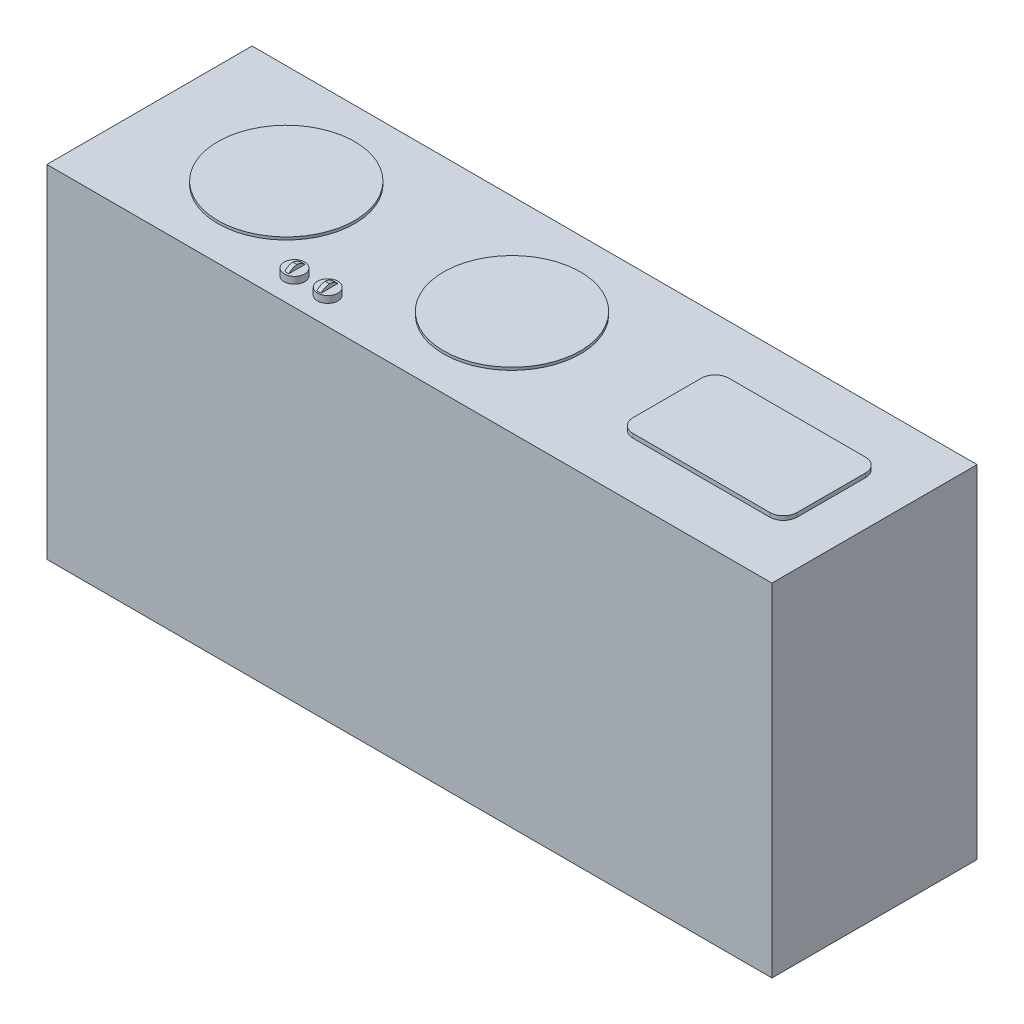
ISO-10303-21;
HEADER;
FILE_DESCRIPTION(('STEP AP214'),'2;1');
FILE_NAME('part.step','',(''),(''),'','','');
FILE_SCHEMA(('AUTOMOTIVE_DESIGN { 1 0 10303 214 1 1 1 1 }'));
ENDSEC;
DATA;
#1=APPLICATION_CONTEXT('core data for automotive mechanical design processes');
#2=APPLICATION_PROTOCOL_DEFINITION('international standard','automotive_design',2000,#1);
#3=PRODUCT_CONTEXT('',#1,'mechanical');
#4=PRODUCT('Part','Part','',(#3));
#5=PRODUCT_RELATED_PRODUCT_CATEGORY('part','',(#4));
#6=PRODUCT_DEFINITION_FORMATION('','',#4);
#7=PRODUCT_DEFINITION_CONTEXT('part definition',#1,'design');
#8=PRODUCT_DEFINITION('design','',#6,#7);
#9=PRODUCT_DEFINITION_SHAPE('','',#8);
#10=(LENGTH_UNIT() NAMED_UNIT(*) SI_UNIT(.MILLI.,.METRE.));
#11=(NAMED_UNIT(*) PLANE_ANGLE_UNIT() SI_UNIT($,.RADIAN.));
#12=(NAMED_UNIT(*) SI_UNIT($,.STERADIAN.) SOLID_ANGLE_UNIT());
#13=UNCERTAINTY_MEASURE_WITH_UNIT(LENGTH_MEASURE(1.E-05),#10,'distance_accuracy_value','');
#14=(GEOMETRIC_REPRESENTATION_CONTEXT(3) GLOBAL_UNCERTAINTY_ASSIGNED_CONTEXT((#13)) GLOBAL_UNIT_ASSIGNED_CONTEXT((#10,
#11,#12)) REPRESENTATION_CONTEXT('',''));
#15=CARTESIAN_POINT('',(0.,0.,0.));
#16=DIRECTION('',(0.,0.,1.));
#17=DIRECTION('',(1.,0.,0.));
#18=AXIS2_PLACEMENT_3D('',#15,#16,#17);
#19=CARTESIAN_POINT('',(0.,25.,0.));
#20=DIRECTION('',(0.,1.,0.));
#21=DIRECTION('',(0.,0.,1.));
#22=AXIS2_PLACEMENT_3D('',#19,#20,#21);
#23=PLANE('',#22);
#24=CARTESIAN_POINT('',(-10.3997029520215,25.,5.50084864158862));
#25=DIRECTION('',(0.,1.,0.));
#26=DIRECTION('',(0.,0.,1.));
#27=AXIS2_PLACEMENT_3D('',#24,#25,#26);
#28=CIRCLE('',#27,0.75);
#29=CARTESIAN_POINT('',(-10.3997029520215,25.,6.25084864158862));
#30=VERTEX_POINT('',#29);
#31=EDGE_CURVE('E222',#30,#30,#28,.T.);
#32=ORIENTED_EDGE('',*,*,#31,.F.);
#33=EDGE_LOOP('',(#32));
#34=FACE_BOUND('',#33,.T.);
#35=CARTESIAN_POINT('',(-7.96817965296981,25.,5.50084864158862));
#36=DIRECTION('',(0.,1.,0.));
#37=DIRECTION('',(0.,0.,1.));
#38=AXIS2_PLACEMENT_3D('',#35,#36,#37);
#39=CIRCLE('',#38,0.75);
#40=CARTESIAN_POINT('',(-7.96817965296981,25.,6.25084864158862));
#41=VERTEX_POINT('',#40);
#42=EDGE_CURVE('E203',#41,#41,#39,.T.);
#43=ORIENTED_EDGE('',*,*,#42,.F.);
#44=EDGE_LOOP('',(#43));
#45=FACE_BOUND('',#44,.T.);
#46=CARTESIAN_POINT('',(-16.5,25.,0.));
#47=DIRECTION('',(0.,1.,0.));
#48=DIRECTION('',(0.,0.,1.));
#49=AXIS2_PLACEMENT_3D('',#46,#47,#48);
#50=CIRCLE('',#49,5.);
#51=CARTESIAN_POINT('',(-16.5,25.,5.));
#52=VERTEX_POINT('',#51);
#53=EDGE_CURVE('E207',#52,#52,#50,.T.);
#54=ORIENTED_EDGE('',*,*,#53,.F.);
#55=EDGE_LOOP('',(#54));
#56=FACE_BOUND('',#55,.T.);
#57=CARTESIAN_POINT('',(0.,25.,0.));
#58=DIRECTION('',(0.,1.,0.));
#59=DIRECTION('',(0.,0.,1.));
#60=AXIS2_PLACEMENT_3D('',#57,#58,#59);
#61=CIRCLE('',#60,5.);
#62=CARTESIAN_POINT('',(0.,25.,5.));
#63=VERTEX_POINT('',#62);
#64=EDGE_CURVE('E219',#63,#63,#61,.T.);
#65=ORIENTED_EDGE('',*,*,#64,.F.);
#66=EDGE_LOOP('',(#65));
#67=FACE_BOUND('',#66,.T.);
#68=DIRECTION('',(0.,0.,-1.));
#69=VECTOR('',#68,1.);
#70=CARTESIAN_POINT('',(26.5,25.,-7.5));
#71=LINE('',#70,#69);
#72=CARTESIAN_POINT('',(26.5,25.,7.5));
#73=VERTEX_POINT('',#72);
#74=CARTESIAN_POINT('',(26.5,25.,-7.5));
#75=VERTEX_POINT('',#74);
#76=EDGE_CURVE('E224',#73,#75,#71,.T.);
#77=ORIENTED_EDGE('',*,*,#76,.T.);
#78=DIRECTION('',(-1.,0.,0.));
#79=VECTOR('',#78,1.);
#80=CARTESIAN_POINT('',(-26.5,25.,-7.5));
#81=LINE('',#80,#79);
#82=CARTESIAN_POINT('',(-26.5,25.,-7.5));
#83=VERTEX_POINT('',#82);
#84=EDGE_CURVE('E227',#75,#83,#81,.T.);
#85=ORIENTED_EDGE('',*,*,#84,.T.);
#86=DIRECTION('',(0.,0.,1.));
#87=VECTOR('',#86,1.);
#88=CARTESIAN_POINT('',(-26.5,25.,-7.5));
#89=LINE('',#88,#87);
#90=CARTESIAN_POINT('',(-26.5,25.,7.5));
#91=VERTEX_POINT('',#90);
#92=EDGE_CURVE('E230',#83,#91,#89,.T.);
#93=ORIENTED_EDGE('',*,*,#92,.T.);
#94=DIRECTION('',(1.,0.,0.));
#95=VECTOR('',#94,1.);
#96=CARTESIAN_POINT('',(-26.5,25.,7.5));
#97=LINE('',#96,#95);
#98=EDGE_CURVE('E232',#91,#73,#97,.T.);
#99=ORIENTED_EDGE('',*,*,#98,.T.);
#100=EDGE_LOOP('',(#77,#85,#93,#99));
#101=FACE_BOUND('',#100,.T.);
#102=DIRECTION('',(-1.,0.,0.));
#103=VECTOR('',#102,1.);
#104=CARTESIAN_POINT('',(11.2507281110651,25.,-3.59474483548655));
#105=LINE('',#104,#103);
#106=CARTESIAN_POINT('',(22.2507281110651,25.,-3.59474483548655));
#107=VERTEX_POINT('',#106);
#108=CARTESIAN_POINT('',(12.2507281110651,25.,-3.59474483548655));
#109=VERTEX_POINT('',#108);
#110=EDGE_CURVE('E301',#107,#109,#105,.T.);
#111=ORIENTED_EDGE('',*,*,#110,.F.);
#112=CARTESIAN_POINT('',(22.2507281110651,25.,-2.59474483548655));
#113=DIRECTION('',(0.,1.,0.));
#114=DIRECTION('',(0.,0.,1.));
#115=AXIS2_PLACEMENT_3D('',#112,#113,#114);
#116=CIRCLE('',#115,1.);
#117=CARTESIAN_POINT('',(23.2507281110651,25.,-2.59474483548655));
#118=VERTEX_POINT('',#117);
#119=EDGE_CURVE('E286',#107,#118,#116,.F.);
#120=ORIENTED_EDGE('',*,*,#119,.T.);
#121=DIRECTION('',(0.,0.,-1.));
#122=VECTOR('',#121,1.);
#123=CARTESIAN_POINT('',(23.2507281110651,25.,-3.59474483548655));
#124=LINE('',#123,#122);
#125=CARTESIAN_POINT('',(23.2507281110651,25.,2.40525516451345));
#126=VERTEX_POINT('',#125);
#127=EDGE_CURVE('E297',#126,#118,#124,.T.);
#128=ORIENTED_EDGE('',*,*,#127,.F.);
#129=CARTESIAN_POINT('',(22.2507281110651,25.,2.40525516451345));
#130=DIRECTION('',(0.,1.,0.));
#131=DIRECTION('',(0.,0.,1.));
#132=AXIS2_PLACEMENT_3D('',#129,#130,#131);
#133=CIRCLE('',#132,1.);
#134=CARTESIAN_POINT('',(22.2507281110651,25.,3.40525516451345));
#135=VERTEX_POINT('',#134);
#136=EDGE_CURVE('E288',#126,#135,#133,.F.);
#137=ORIENTED_EDGE('',*,*,#136,.T.);
#138=DIRECTION('',(1.,0.,0.));
#139=VECTOR('',#138,1.);
#140=CARTESIAN_POINT('',(11.2507281110651,25.,3.40525516451345));
#141=LINE('',#140,#139);
#142=CARTESIAN_POINT('',(12.2507281110651,25.,3.40525516451345));
#143=VERTEX_POINT('',#142);
#144=EDGE_CURVE('E594',#143,#135,#141,.T.);
#145=ORIENTED_EDGE('',*,*,#144,.F.);
#146=CARTESIAN_POINT('',(12.2507281110651,25.,2.40525516451345));
#147=DIRECTION('',(0.,1.,0.));
#148=DIRECTION('',(0.,0.,1.));
#149=AXIS2_PLACEMENT_3D('',#146,#147,#148);
#150=CIRCLE('',#149,1.);
#151=CARTESIAN_POINT('',(11.2507281110651,25.,2.40525516451345));
#152=VERTEX_POINT('',#151);
#153=EDGE_CURVE('E282',#143,#152,#150,.F.);
#154=ORIENTED_EDGE('',*,*,#153,.T.);
#155=DIRECTION('',(0.,0.,1.));
#156=VECTOR('',#155,1.);
#157=CARTESIAN_POINT('',(11.2507281110651,25.,-3.59474483548655));
#158=LINE('',#157,#156);
#159=CARTESIAN_POINT('',(11.2507281110651,25.,-2.59474483548655));
#160=VERTEX_POINT('',#159);
#161=EDGE_CURVE('E591',#160,#152,#158,.T.);
#162=ORIENTED_EDGE('',*,*,#161,.F.);
#163=CARTESIAN_POINT('',(12.2507281110651,25.,-2.59474483548655));
#164=DIRECTION('',(0.,1.,0.));
#165=DIRECTION('',(0.,0.,1.));
#166=AXIS2_PLACEMENT_3D('',#163,#164,#165);
#167=CIRCLE('',#166,1.);
#168=EDGE_CURVE('E284',#160,#109,#167,.F.);
#169=ORIENTED_EDGE('',*,*,#168,.T.);
#170=EDGE_LOOP('',(#111,#120,#128,#137,#145,#154,#162,#169));
#171=FACE_BOUND('',#170,.T.);
#172=ADVANCED_FACE('F33',(#34,#45,#56,#67,#101,#171),#23,.T.);
#173=CARTESIAN_POINT('',(26.5,25.,-7.5));
#174=DIRECTION('',(-1.,0.,0.));
#175=DIRECTION('',(0.,0.,1.));
#176=AXIS2_PLACEMENT_3D('',#173,#174,#175);
#177=PLANE('',#176);
#178=DIRECTION('',(0.,0.,-1.));
#179=VECTOR('',#178,1.);
#180=CARTESIAN_POINT('',(26.5,0.,-7.5));
#181=LINE('',#180,#179);
#182=CARTESIAN_POINT('',(26.5,0.,7.5));
#183=VERTEX_POINT('',#182);
#184=CARTESIAN_POINT('',(26.5,0.,-7.5));
#185=VERTEX_POINT('',#184);
#186=EDGE_CURVE('E218',#183,#185,#181,.T.);
#187=ORIENTED_EDGE('',*,*,#186,.T.);
#188=DIRECTION('',(0.,-1.,0.));
#189=VECTOR('',#188,1.);
#190=CARTESIAN_POINT('',(26.5,25.,-7.5));
#191=LINE('',#190,#189);
#192=EDGE_CURVE('E223',#75,#185,#191,.T.);
#193=ORIENTED_EDGE('',*,*,#192,.F.);
#194=ORIENTED_EDGE('',*,*,#76,.F.);
#195=DIRECTION('',(0.,-1.,0.));
#196=VECTOR('',#195,1.);
#197=CARTESIAN_POINT('',(26.5,25.,7.5));
#198=LINE('',#197,#196);
#199=EDGE_CURVE('E234',#73,#183,#198,.T.);
#200=ORIENTED_EDGE('',*,*,#199,.T.);
#201=EDGE_LOOP('',(#187,#193,#194,#200));
#202=FACE_BOUND('',#201,.T.);
#203=ADVANCED_FACE('F327',(#202),#177,.F.);
#204=CARTESIAN_POINT('',(-26.5,25.,-7.5));
#205=DIRECTION('',(0.,0.,1.));
#206=DIRECTION('',(1.,0.,0.));
#207=AXIS2_PLACEMENT_3D('',#204,#205,#206);
#208=PLANE('',#207);
#209=DIRECTION('',(-1.,0.,0.));
#210=VECTOR('',#209,1.);
#211=CARTESIAN_POINT('',(-26.5,0.,-7.5));
#212=LINE('',#211,#210);
#213=CARTESIAN_POINT('',(-26.5,0.,-7.5));
#214=VERTEX_POINT('',#213);
#215=EDGE_CURVE('E237',#185,#214,#212,.T.);
#216=ORIENTED_EDGE('',*,*,#215,.T.);
#217=DIRECTION('',(0.,-1.,0.));
#218=VECTOR('',#217,1.);
#219=CARTESIAN_POINT('',(-26.5,25.,-7.5));
#220=LINE('',#219,#218);
#221=EDGE_CURVE('E247',#83,#214,#220,.T.);
#222=ORIENTED_EDGE('',*,*,#221,.F.);
#223=ORIENTED_EDGE('',*,*,#84,.F.);
#224=ORIENTED_EDGE('',*,*,#192,.T.);
#225=EDGE_LOOP('',(#216,#222,#223,#224));
#226=FACE_BOUND('',#225,.T.);
#227=ADVANCED_FACE('F335',(#226),#208,.F.);
#228=CARTESIAN_POINT('',(-26.5,25.,-7.5));
#229=DIRECTION('',(1.,0.,0.));
#230=DIRECTION('',(0.,0.,-1.));
#231=AXIS2_PLACEMENT_3D('',#228,#229,#230);
#232=PLANE('',#231);
#233=DIRECTION('',(0.,0.,1.));
#234=VECTOR('',#233,1.);
#235=CARTESIAN_POINT('',(-26.5,0.,-7.5));
#236=LINE('',#235,#234);
#237=CARTESIAN_POINT('',(-26.5,0.,7.5));
#238=VERTEX_POINT('',#237);
#239=EDGE_CURVE('E239',#214,#238,#236,.T.);
#240=ORIENTED_EDGE('',*,*,#239,.T.);
#241=DIRECTION('',(0.,-1.,0.));
#242=VECTOR('',#241,1.);
#243=CARTESIAN_POINT('',(-26.5,25.,7.5));
#244=LINE('',#243,#242);
#245=EDGE_CURVE('E244',#91,#238,#244,.T.);
#246=ORIENTED_EDGE('',*,*,#245,.F.);
#247=ORIENTED_EDGE('',*,*,#92,.F.);
#248=ORIENTED_EDGE('',*,*,#221,.T.);
#249=EDGE_LOOP('',(#240,#246,#247,#248));
#250=FACE_BOUND('',#249,.T.);
#251=ADVANCED_FACE('F351',(#250),#232,.F.);
#252=CARTESIAN_POINT('',(-26.5,25.,7.5));
#253=DIRECTION('',(0.,0.,-1.));
#254=DIRECTION('',(-1.,0.,0.));
#255=AXIS2_PLACEMENT_3D('',#252,#253,#254);
#256=PLANE('',#255);
#257=DIRECTION('',(1.,0.,0.));
#258=VECTOR('',#257,1.);
#259=CARTESIAN_POINT('',(-26.5,0.,7.5));
#260=LINE('',#259,#258);
#261=EDGE_CURVE('E228',#238,#183,#260,.T.);
#262=ORIENTED_EDGE('',*,*,#261,.T.);
#263=ORIENTED_EDGE('',*,*,#199,.F.);
#264=ORIENTED_EDGE('',*,*,#98,.F.);
#265=ORIENTED_EDGE('',*,*,#245,.T.);
#266=EDGE_LOOP('',(#262,#263,#264,#265));
#267=FACE_BOUND('',#266,.T.);
#268=ADVANCED_FACE('F347',(#267),#256,.F.);
#269=CARTESIAN_POINT('',(0.,0.,0.));
#270=DIRECTION('',(0.,1.,0.));
#271=DIRECTION('',(0.,0.,1.));
#272=AXIS2_PLACEMENT_3D('',#269,#270,#271);
#273=PLANE('',#272);
#274=ORIENTED_EDGE('',*,*,#186,.F.);
#275=ORIENTED_EDGE('',*,*,#261,.F.);
#276=ORIENTED_EDGE('',*,*,#239,.F.);
#277=ORIENTED_EDGE('',*,*,#215,.F.);
#278=EDGE_LOOP('',(#274,#275,#276,#277));
#279=FACE_BOUND('',#278,.T.);
#280=ADVANCED_FACE('F344',(#279),#273,.F.);
#281=CARTESIAN_POINT('',(0.,25.2,0.));
#282=DIRECTION('',(0.,-1.,0.));
#283=DIRECTION('',(0.,0.,-1.));
#284=AXIS2_PLACEMENT_3D('',#281,#282,#283);
#285=CYLINDRICAL_SURFACE('',#284,5.);
#286=CARTESIAN_POINT('',(0.,25.2,0.));
#287=DIRECTION('',(0.,1.,0.));
#288=DIRECTION('',(0.,0.,1.));
#289=AXIS2_PLACEMENT_3D('',#286,#287,#288);
#290=CIRCLE('',#289,5.);
#291=CARTESIAN_POINT('',(0.,25.2,5.));
#292=VERTEX_POINT('',#291);
#293=EDGE_CURVE('E213',#292,#292,#290,.T.);
#294=ORIENTED_EDGE('',*,*,#293,.F.);
#295=EDGE_LOOP('',(#294));
#296=FACE_BOUND('',#295,.T.);
#297=ORIENTED_EDGE('',*,*,#64,.T.);
#298=EDGE_LOOP('',(#297));
#299=FACE_BOUND('',#298,.T.);
#300=ADVANCED_FACE('F342',(#296,#299),#285,.T.);
#301=CARTESIAN_POINT('',(0.,25.2,0.));
#302=DIRECTION('',(0.,1.,0.));
#303=DIRECTION('',(0.,0.,1.));
#304=AXIS2_PLACEMENT_3D('',#301,#302,#303);
#305=PLANE('',#304);
#306=ORIENTED_EDGE('',*,*,#293,.T.);
#307=EDGE_LOOP('',(#306));
#308=FACE_BOUND('',#307,.T.);
#309=ADVANCED_FACE('F522',(#308),#305,.T.);
#310=CARTESIAN_POINT('',(-16.5,25.2,0.));
#311=DIRECTION('',(0.,-1.,0.));
#312=DIRECTION('',(0.,0.,-1.));
#313=AXIS2_PLACEMENT_3D('',#310,#311,#312);
#314=CYLINDRICAL_SURFACE('',#313,5.);
#315=CARTESIAN_POINT('',(-16.5,25.2,0.));
#316=DIRECTION('',(0.,1.,0.));
#317=DIRECTION('',(0.,0.,1.));
#318=AXIS2_PLACEMENT_3D('',#315,#316,#317);
#319=CIRCLE('',#318,5.);
#320=CARTESIAN_POINT('',(-16.5,25.2,5.));
#321=VERTEX_POINT('',#320);
#322=EDGE_CURVE('E210',#321,#321,#319,.T.);
#323=ORIENTED_EDGE('',*,*,#322,.F.);
#324=EDGE_LOOP('',(#323));
#325=FACE_BOUND('',#324,.T.);
#326=ORIENTED_EDGE('',*,*,#53,.T.);
#327=EDGE_LOOP('',(#326));
#328=FACE_BOUND('',#327,.T.);
#329=ADVANCED_FACE('F514',(#325,#328),#314,.T.);
#330=CARTESIAN_POINT('',(-16.5,25.2,0.));
#331=DIRECTION('',(0.,1.,0.));
#332=DIRECTION('',(0.,0.,1.));
#333=AXIS2_PLACEMENT_3D('',#330,#331,#332);
#334=PLANE('',#333);
#335=ORIENTED_EDGE('',*,*,#322,.T.);
#336=EDGE_LOOP('',(#335));
#337=FACE_BOUND('',#336,.T.);
#338=ADVANCED_FACE('F507',(#337),#334,.T.);
#339=CARTESIAN_POINT('',(-7.96817965296981,25.5,5.50084864158862));
#340=DIRECTION('',(0.,-1.,0.));
#341=DIRECTION('',(0.,0.,-1.));
#342=AXIS2_PLACEMENT_3D('',#339,#340,#341);
#343=CYLINDRICAL_SURFACE('',#342,0.75);
#344=CARTESIAN_POINT('',(-7.96817965296981,25.5,5.50084864158862));
#345=DIRECTION('',(0.,1.,0.));
#346=DIRECTION('',(0.,0.,1.));
#347=AXIS2_PLACEMENT_3D('',#344,#345,#346);
#348=CIRCLE('',#347,0.75);
#349=CARTESIAN_POINT('',(-7.96817965296981,25.5,6.25084864158862));
#350=VERTEX_POINT('',#349);
#351=EDGE_CURVE('E204',#350,#350,#348,.T.);
#352=ORIENTED_EDGE('',*,*,#351,.F.);
#353=EDGE_LOOP('',(#352));
#354=FACE_BOUND('',#353,.T.);
#355=ORIENTED_EDGE('',*,*,#42,.T.);
#356=EDGE_LOOP('',(#355));
#357=FACE_BOUND('',#356,.T.);
#358=ADVANCED_FACE('F499',(#354,#357),#343,.T.);
#359=CARTESIAN_POINT('',(0.,25.5,0.));
#360=DIRECTION('',(0.,1.,0.));
#361=DIRECTION('',(0.,0.,1.));
#362=AXIS2_PLACEMENT_3D('',#359,#360,#361);
#363=PLANE('',#362);
#364=DIRECTION('',(0.,0.,1.));
#365=VECTOR('',#364,1.);
#366=CARTESIAN_POINT('',(-8.14054883727522,25.5,6.12687016507607));
#367=LINE('',#366,#365);
#368=CARTESIAN_POINT('',(-8.14054883727522,25.5,4.89916956078673));
#369=VERTEX_POINT('',#368);
#370=CARTESIAN_POINT('',(-8.14054883727522,25.5,6.12687016507607));
#371=VERTEX_POINT('',#370);
#372=EDGE_CURVE('E190',#369,#371,#367,.T.);
#373=ORIENTED_EDGE('',*,*,#372,.F.);
#374=DIRECTION('',(-1.,0.,0.));
#375=VECTOR('',#374,1.);
#376=CARTESIAN_POINT('',(-8.14054883727522,25.5,4.89916956078673));
#377=LINE('',#376,#375);
#378=CARTESIAN_POINT('',(-7.83253803311368,25.5,4.89916956078673));
#379=VERTEX_POINT('',#378);
#380=EDGE_CURVE('E197',#379,#369,#377,.T.);
#381=ORIENTED_EDGE('',*,*,#380,.F.);
#382=DIRECTION('',(0.,0.,-1.));
#383=VECTOR('',#382,1.);
#384=CARTESIAN_POINT('',(-7.83253803311368,25.5,6.12687016507607));
#385=LINE('',#384,#383);
#386=CARTESIAN_POINT('',(-7.83253803311368,25.5,6.12687016507607));
#387=VERTEX_POINT('',#386);
#388=EDGE_CURVE('E195',#387,#379,#385,.T.);
#389=ORIENTED_EDGE('',*,*,#388,.F.);
#390=DIRECTION('',(1.,0.,0.));
#391=VECTOR('',#390,1.);
#392=CARTESIAN_POINT('',(-8.14054883727522,25.5,6.12687016507607));
#393=LINE('',#392,#391);
#394=EDGE_CURVE('E192',#371,#387,#393,.T.);
#395=ORIENTED_EDGE('',*,*,#394,.F.);
#396=EDGE_LOOP('',(#373,#381,#389,#395));
#397=FACE_BOUND('',#396,.T.);
#398=ORIENTED_EDGE('',*,*,#351,.T.);
#399=EDGE_LOOP('',(#398));
#400=FACE_BOUND('',#399,.T.);
#401=ADVANCED_FACE('F312',(#397,#400),#363,.T.);
#402=CARTESIAN_POINT('',(-10.3997029520215,25.5,5.50084864158862));
#403=DIRECTION('',(0.,-1.,0.));
#404=DIRECTION('',(0.,0.,-1.));
#405=AXIS2_PLACEMENT_3D('',#402,#403,#404);
#406=CYLINDRICAL_SURFACE('',#405,0.75);
#407=CARTESIAN_POINT('',(-10.3997029520215,25.5,5.50084864158862));
#408=DIRECTION('',(0.,1.,0.));
#409=DIRECTION('',(0.,0.,1.));
#410=AXIS2_PLACEMENT_3D('',#407,#408,#409);
#411=CIRCLE('',#410,0.75);
#412=CARTESIAN_POINT('',(-10.3997029520215,25.5,6.25084864158862));
#413=VERTEX_POINT('',#412);
#414=EDGE_CURVE('E200',#413,#413,#411,.F.);
#415=ORIENTED_EDGE('',*,*,#414,.T.);
#416=EDGE_LOOP('',(#415));
#417=FACE_BOUND('',#416,.T.);
#418=ORIENTED_EDGE('',*,*,#31,.T.);
#419=EDGE_LOOP('',(#418));
#420=FACE_BOUND('',#419,.T.);
#421=ADVANCED_FACE('F484',(#417,#420),#406,.T.);
#422=CARTESIAN_POINT('',(0.,25.5,0.));
#423=DIRECTION('',(0.,1.,0.));
#424=DIRECTION('',(0.,0.,1.));
#425=AXIS2_PLACEMENT_3D('',#422,#423,#424);
#426=PLANE('',#425);
#427=DIRECTION('',(0.,0.,1.));
#428=VECTOR('',#427,1.);
#429=CARTESIAN_POINT('',(-10.5403281985983,25.5,6.07704960419309));
#430=LINE('',#429,#428);
#431=CARTESIAN_POINT('',(-10.5403281985983,25.5,4.88581295215074));
#432=VERTEX_POINT('',#431);
#433=CARTESIAN_POINT('',(-10.5403281985983,25.5,6.07704960419309));
#434=VERTEX_POINT('',#433);
#435=EDGE_CURVE('E183',#432,#434,#430,.T.);
#436=ORIENTED_EDGE('',*,*,#435,.F.);
#437=DIRECTION('',(-1.,0.,0.));
#438=VECTOR('',#437,1.);
#439=CARTESIAN_POINT('',(-10.5403281985983,25.5,4.88581295215074));
#440=LINE('',#439,#438);
#441=CARTESIAN_POINT('',(-10.2393980436624,25.5,4.88581295215074));
#442=VERTEX_POINT('',#441);
#443=EDGE_CURVE('E178',#442,#432,#440,.T.);
#444=ORIENTED_EDGE('',*,*,#443,.F.);
#445=DIRECTION('',(0.,0.,-1.));
#446=VECTOR('',#445,1.);
#447=CARTESIAN_POINT('',(-10.2393980436624,25.5,6.07704960419309));
#448=LINE('',#447,#446);
#449=CARTESIAN_POINT('',(-10.2393980436624,25.5,6.07704960419309));
#450=VERTEX_POINT('',#449);
#451=EDGE_CURVE('E162',#450,#442,#448,.T.);
#452=ORIENTED_EDGE('',*,*,#451,.F.);
#453=DIRECTION('',(1.,0.,0.));
#454=VECTOR('',#453,1.);
#455=CARTESIAN_POINT('',(-10.5403281985983,25.5,6.07704960419309));
#456=LINE('',#455,#454);
#457=EDGE_CURVE('E175',#434,#450,#456,.T.);
#458=ORIENTED_EDGE('',*,*,#457,.F.);
#459=EDGE_LOOP('',(#436,#444,#452,#458));
#460=FACE_BOUND('',#459,.T.);
#461=ORIENTED_EDGE('',*,*,#414,.F.);
#462=EDGE_LOOP('',(#461));
#463=FACE_BOUND('',#462,.T.);
#464=ADVANCED_FACE('F173',(#460,#463),#426,.T.);
#465=CARTESIAN_POINT('',(-8.14054883727522,25.8,6.12687016507607));
#466=DIRECTION('',(1.,0.,0.));
#467=DIRECTION('',(0.,0.,-1.));
#468=AXIS2_PLACEMENT_3D('',#465,#466,#467);
#469=PLANE('',#468);
#470=ORIENTED_EDGE('',*,*,#372,.T.);
#471=CARTESIAN_POINT('',(-8.14054883727522,24.8,5.41272732222178));
#472=DIRECTION('',(1.,0.,0.));
#473=DIRECTION('',(0.,0.,-1.));
#474=AXIS2_PLACEMENT_3D('',#471,#472,#473);
#475=CIRCLE('',#474,1.);
#476=CARTESIAN_POINT('',(-8.14054883727522,25.7949579922178,5.5130198629314));
#477=VERTEX_POINT('',#476);
#478=EDGE_CURVE('E11',#371,#477,#475,.F.);
#479=ORIENTED_EDGE('',*,*,#478,.T.);
#480=CARTESIAN_POINT('',(-8.14054883727522,24.8,5.61331240364102));
#481=DIRECTION('',(1.,0.,0.));
#482=DIRECTION('',(0.,0.,-1.));
#483=AXIS2_PLACEMENT_3D('',#480,#481,#482);
#484=CIRCLE('',#483,1.);
#485=EDGE_CURVE('E42',#477,#369,#484,.F.);
#486=ORIENTED_EDGE('',*,*,#485,.T.);
#487=EDGE_LOOP('',(#470,#479,#486));
#488=FACE_BOUND('',#487,.T.);
#489=ADVANCED_FACE('F310',(#488),#469,.F.);
#490=CARTESIAN_POINT('',(-7.83253803311368,25.8,6.12687016507607));
#491=DIRECTION('',(-1.,0.,0.));
#492=DIRECTION('',(0.,0.,1.));
#493=AXIS2_PLACEMENT_3D('',#490,#491,#492);
#494=PLANE('',#493);
#495=CARTESIAN_POINT('',(-7.83253803311368,24.8,5.61331240364102));
#496=DIRECTION('',(-1.,0.,0.));
#497=DIRECTION('',(0.,0.,1.));
#498=AXIS2_PLACEMENT_3D('',#495,#496,#497);
#499=CIRCLE('',#498,1.);
#500=CARTESIAN_POINT('',(-7.83253803311368,25.7949579922178,5.5130198629314));
#501=VERTEX_POINT('',#500);
#502=EDGE_CURVE('E56',#379,#501,#499,.F.);
#503=ORIENTED_EDGE('',*,*,#502,.T.);
#504=CARTESIAN_POINT('',(-7.83253803311368,24.8,5.41272732222178));
#505=DIRECTION('',(-1.,0.,0.));
#506=DIRECTION('',(0.,0.,1.));
#507=AXIS2_PLACEMENT_3D('',#504,#505,#506);
#508=CIRCLE('',#507,1.);
#509=EDGE_CURVE('E294',#501,#387,#508,.F.);
#510=ORIENTED_EDGE('',*,*,#509,.T.);
#511=ORIENTED_EDGE('',*,*,#388,.T.);
#512=EDGE_LOOP('',(#503,#510,#511));
#513=FACE_BOUND('',#512,.T.);
#514=ADVANCED_FACE('F315',(#513),#494,.F.);
#515=CARTESIAN_POINT('',(-10.5403281985983,25.8,6.07704960419309));
#516=DIRECTION('',(1.,0.,0.));
#517=DIRECTION('',(0.,0.,-1.));
#518=AXIS2_PLACEMENT_3D('',#515,#516,#517);
#519=PLANE('',#518);
#520=CARTESIAN_POINT('',(-10.5403281985983,24.8,5.3629067613388));
#521=DIRECTION('',(1.,0.,0.));
#522=DIRECTION('',(0.,0.,-1.));
#523=AXIS2_PLACEMENT_3D('',#520,#521,#522);
#524=CIRCLE('',#523,1.);
#525=CARTESIAN_POINT('',(-10.5403281985983,25.7929511261434,5.48143127817191));
#526=VERTEX_POINT('',#525);
#527=EDGE_CURVE('E182',#434,#526,#524,.F.);
#528=ORIENTED_EDGE('',*,*,#527,.T.);
#529=CARTESIAN_POINT('',(-10.5403281985983,24.8,5.59995579500502));
#530=DIRECTION('',(1.,0.,0.));
#531=DIRECTION('',(0.,0.,-1.));
#532=AXIS2_PLACEMENT_3D('',#529,#530,#531);
#533=CIRCLE('',#532,1.);
#534=EDGE_CURVE('E168',#526,#432,#533,.F.);
#535=ORIENTED_EDGE('',*,*,#534,.T.);
#536=ORIENTED_EDGE('',*,*,#435,.T.);
#537=EDGE_LOOP('',(#528,#535,#536));
#538=FACE_BOUND('',#537,.T.);
#539=ADVANCED_FACE('F317',(#538),#519,.F.);
#540=CARTESIAN_POINT('',(-10.2393980436624,25.8,6.07704960419309));
#541=DIRECTION('',(-1.,0.,0.));
#542=DIRECTION('',(0.,0.,1.));
#543=AXIS2_PLACEMENT_3D('',#540,#541,#542);
#544=PLANE('',#543);
#545=ORIENTED_EDGE('',*,*,#451,.T.);
#546=CARTESIAN_POINT('',(-10.2393980436624,24.8,5.59995579500502));
#547=DIRECTION('',(-1.,0.,0.));
#548=DIRECTION('',(0.,0.,1.));
#549=AXIS2_PLACEMENT_3D('',#546,#547,#548);
#550=CIRCLE('',#549,1.);
#551=CARTESIAN_POINT('',(-10.2393980436624,25.7929511261434,5.48143127817191));
#552=VERTEX_POINT('',#551);
#553=EDGE_CURVE('E163',#442,#552,#550,.F.);
#554=ORIENTED_EDGE('',*,*,#553,.T.);
#555=CARTESIAN_POINT('',(-10.2393980436624,24.8,5.3629067613388));
#556=DIRECTION('',(-1.,0.,0.));
#557=DIRECTION('',(0.,0.,1.));
#558=AXIS2_PLACEMENT_3D('',#555,#556,#557);
#559=CIRCLE('',#558,1.);
#560=EDGE_CURVE('E159',#552,#450,#559,.F.);
#561=ORIENTED_EDGE('',*,*,#560,.T.);
#562=EDGE_LOOP('',(#545,#554,#561));
#563=FACE_BOUND('',#562,.T.);
#564=ADVANCED_FACE('F161',(#563),#544,.F.);
#565=CARTESIAN_POINT('',(23.2507281110651,25.3,-3.59474483548655));
#566=DIRECTION('',(-1.,0.,0.));
#567=DIRECTION('',(0.,0.,1.));
#568=AXIS2_PLACEMENT_3D('',#565,#566,#567);
#569=PLANE('',#568);
#570=ORIENTED_EDGE('',*,*,#127,.T.);
#571=DIRECTION('',(0.,-1.,0.));
#572=VECTOR('',#571,1.);
#573=CARTESIAN_POINT('',(23.2507281110651,25.3,-2.59474483548655));
#574=LINE('',#573,#572);
#575=CARTESIAN_POINT('',(23.2507281110651,25.3,-2.59474483548655));
#576=VERTEX_POINT('',#575);
#577=EDGE_CURVE('E280',#118,#576,#574,.F.);
#578=ORIENTED_EDGE('',*,*,#577,.T.);
#579=DIRECTION('',(0.,0.,-1.));
#580=VECTOR('',#579,1.);
#581=CARTESIAN_POINT('',(23.2507281110651,25.3,-3.59474483548655));
#582=LINE('',#581,#580);
#583=CARTESIAN_POINT('',(23.2507281110651,25.3,2.40525516451345));
#584=VERTEX_POINT('',#583);
#585=EDGE_CURVE('E598',#584,#576,#582,.T.);
#586=ORIENTED_EDGE('',*,*,#585,.F.);
#587=DIRECTION('',(0.,-1.,0.));
#588=VECTOR('',#587,1.);
#589=CARTESIAN_POINT('',(23.2507281110651,25.3,2.40525516451345));
#590=LINE('',#589,#588);
#591=EDGE_CURVE('E277',#584,#126,#590,.T.);
#592=ORIENTED_EDGE('',*,*,#591,.T.);
#593=EDGE_LOOP('',(#570,#578,#586,#592));
#594=FACE_BOUND('',#593,.T.);
#595=ADVANCED_FACE('F442',(#594),#569,.F.);
#596=CARTESIAN_POINT('',(11.2507281110651,25.3,-3.59474483548655));
#597=DIRECTION('',(0.,0.,1.));
#598=DIRECTION('',(1.,0.,0.));
#599=AXIS2_PLACEMENT_3D('',#596,#597,#598);
#600=PLANE('',#599);
#601=ORIENTED_EDGE('',*,*,#110,.T.);
#602=DIRECTION('',(0.,-1.,0.));
#603=VECTOR('',#602,1.);
#604=CARTESIAN_POINT('',(12.2507281110651,25.3,-3.59474483548655));
#605=LINE('',#604,#603);
#606=CARTESIAN_POINT('',(12.2507281110651,25.3,-3.59474483548655));
#607=VERTEX_POINT('',#606);
#608=EDGE_CURVE('E275',#109,#607,#605,.F.);
#609=ORIENTED_EDGE('',*,*,#608,.T.);
#610=DIRECTION('',(-1.,0.,0.));
#611=VECTOR('',#610,1.);
#612=CARTESIAN_POINT('',(11.2507281110651,25.3,-3.59474483548655));
#613=LINE('',#612,#611);
#614=CARTESIAN_POINT('',(22.2507281110651,25.3,-3.59474483548655));
#615=VERTEX_POINT('',#614);
#616=EDGE_CURVE('E602',#615,#607,#613,.T.);
#617=ORIENTED_EDGE('',*,*,#616,.F.);
#618=DIRECTION('',(0.,-1.,0.));
#619=VECTOR('',#618,1.);
#620=CARTESIAN_POINT('',(22.2507281110651,25.3,-3.59474483548655));
#621=LINE('',#620,#619);
#622=EDGE_CURVE('E272',#615,#107,#621,.T.);
#623=ORIENTED_EDGE('',*,*,#622,.T.);
#624=EDGE_LOOP('',(#601,#609,#617,#623));
#625=FACE_BOUND('',#624,.T.);
#626=ADVANCED_FACE('F434',(#625),#600,.F.);
#627=CARTESIAN_POINT('',(11.2507281110651,25.3,-3.59474483548655));
#628=DIRECTION('',(1.,0.,0.));
#629=DIRECTION('',(0.,0.,-1.));
#630=AXIS2_PLACEMENT_3D('',#627,#628,#629);
#631=PLANE('',#630);
#632=ORIENTED_EDGE('',*,*,#161,.T.);
#633=DIRECTION('',(0.,-1.,0.));
#634=VECTOR('',#633,1.);
#635=CARTESIAN_POINT('',(11.2507281110651,25.3,2.40525516451345));
#636=LINE('',#635,#634);
#637=CARTESIAN_POINT('',(11.2507281110651,25.3,2.40525516451345));
#638=VERTEX_POINT('',#637);
#639=EDGE_CURVE('E262',#152,#638,#636,.F.);
#640=ORIENTED_EDGE('',*,*,#639,.T.);
#641=DIRECTION('',(0.,0.,1.));
#642=VECTOR('',#641,1.);
#643=CARTESIAN_POINT('',(11.2507281110651,25.3,-3.59474483548655));
#644=LINE('',#643,#642);
#645=CARTESIAN_POINT('',(11.2507281110651,25.3,-2.59474483548655));
#646=VERTEX_POINT('',#645);
#647=EDGE_CURVE('E607',#646,#638,#644,.T.);
#648=ORIENTED_EDGE('',*,*,#647,.F.);
#649=DIRECTION('',(0.,-1.,0.));
#650=VECTOR('',#649,1.);
#651=CARTESIAN_POINT('',(11.2507281110651,25.3,-2.59474483548655));
#652=LINE('',#651,#650);
#653=EDGE_CURVE('E259',#646,#160,#652,.T.);
#654=ORIENTED_EDGE('',*,*,#653,.T.);
#655=EDGE_LOOP('',(#632,#640,#648,#654));
#656=FACE_BOUND('',#655,.T.);
#657=ADVANCED_FACE('F426',(#656),#631,.F.);
#658=CARTESIAN_POINT('',(11.2507281110651,25.3,3.40525516451345));
#659=DIRECTION('',(0.,0.,-1.));
#660=DIRECTION('',(-1.,0.,0.));
#661=AXIS2_PLACEMENT_3D('',#658,#659,#660);
#662=PLANE('',#661);
#663=DIRECTION('',(1.,0.,0.));
#664=VECTOR('',#663,1.);
#665=CARTESIAN_POINT('',(11.2507281110651,25.3,3.40525516451345));
#666=LINE('',#665,#664);
#667=CARTESIAN_POINT('',(12.2507281110651,25.3,3.40525516451345));
#668=VERTEX_POINT('',#667);
#669=CARTESIAN_POINT('',(22.2507281110651,25.3,3.40525516451345));
#670=VERTEX_POINT('',#669);
#671=EDGE_CURVE('E185',#668,#670,#666,.T.);
#672=ORIENTED_EDGE('',*,*,#671,.F.);
#673=DIRECTION('',(0.,-1.,0.));
#674=VECTOR('',#673,1.);
#675=CARTESIAN_POINT('',(12.2507281110651,25.3,3.40525516451345));
#676=LINE('',#675,#674);
#677=EDGE_CURVE('E256',#668,#143,#676,.T.);
#678=ORIENTED_EDGE('',*,*,#677,.T.);
#679=ORIENTED_EDGE('',*,*,#144,.T.);
#680=DIRECTION('',(0.,-1.,0.));
#681=VECTOR('',#680,1.);
#682=CARTESIAN_POINT('',(22.2507281110651,25.3,3.40525516451345));
#683=LINE('',#682,#681);
#684=EDGE_CURVE('E254',#135,#670,#683,.F.);
#685=ORIENTED_EDGE('',*,*,#684,.T.);
#686=EDGE_LOOP('',(#672,#678,#679,#685));
#687=FACE_BOUND('',#686,.T.);
#688=ADVANCED_FACE('F418',(#687),#662,.F.);
#689=CARTESIAN_POINT('',(0.,25.3,0.));
#690=DIRECTION('',(0.,1.,0.));
#691=DIRECTION('',(0.,0.,1.));
#692=AXIS2_PLACEMENT_3D('',#689,#690,#691);
#693=PLANE('',#692);
#694=ORIENTED_EDGE('',*,*,#647,.T.);
#695=CARTESIAN_POINT('',(12.2507281110651,25.3,2.40525516451345));
#696=DIRECTION('',(0.,1.,0.));
#697=DIRECTION('',(0.,0.,1.));
#698=AXIS2_PLACEMENT_3D('',#695,#696,#697);
#699=CIRCLE('',#698,1.);
#700=EDGE_CURVE('E270',#638,#668,#699,.T.);
#701=ORIENTED_EDGE('',*,*,#700,.T.);
#702=ORIENTED_EDGE('',*,*,#671,.T.);
#703=CARTESIAN_POINT('',(22.2507281110651,25.3,2.40525516451345));
#704=DIRECTION('',(0.,1.,0.));
#705=DIRECTION('',(0.,0.,1.));
#706=AXIS2_PLACEMENT_3D('',#703,#704,#705);
#707=CIRCLE('',#706,1.);
#708=EDGE_CURVE('E264',#670,#584,#707,.T.);
#709=ORIENTED_EDGE('',*,*,#708,.T.);
#710=ORIENTED_EDGE('',*,*,#585,.T.);
#711=CARTESIAN_POINT('',(22.2507281110651,25.3,-2.59474483548655));
#712=DIRECTION('',(0.,1.,0.));
#713=DIRECTION('',(0.,0.,1.));
#714=AXIS2_PLACEMENT_3D('',#711,#712,#713);
#715=CIRCLE('',#714,1.);
#716=EDGE_CURVE('E266',#576,#615,#715,.T.);
#717=ORIENTED_EDGE('',*,*,#716,.T.);
#718=ORIENTED_EDGE('',*,*,#616,.T.);
#719=CARTESIAN_POINT('',(12.2507281110651,25.3,-2.59474483548655));
#720=DIRECTION('',(0.,1.,0.));
#721=DIRECTION('',(0.,0.,1.));
#722=AXIS2_PLACEMENT_3D('',#719,#720,#721);
#723=CIRCLE('',#722,1.);
#724=EDGE_CURVE('E268',#607,#646,#723,.T.);
#725=ORIENTED_EDGE('',*,*,#724,.T.);
#726=EDGE_LOOP('',(#694,#701,#702,#709,#710,#717,#718,#725));
#727=FACE_BOUND('',#726,.T.);
#728=ADVANCED_FACE('F363',(#727),#693,.T.);
#729=CARTESIAN_POINT('',(12.2507281110651,25.3,2.40525516451345));
#730=DIRECTION('',(0.,-1.,0.));
#731=DIRECTION('',(0.,0.,-1.));
#732=AXIS2_PLACEMENT_3D('',#729,#730,#731);
#733=CYLINDRICAL_SURFACE('',#732,1.);
#734=ORIENTED_EDGE('',*,*,#700,.F.);
#735=ORIENTED_EDGE('',*,*,#639,.F.);
#736=ORIENTED_EDGE('',*,*,#153,.F.);
#737=ORIENTED_EDGE('',*,*,#677,.F.);
#738=EDGE_LOOP('',(#734,#735,#736,#737));
#739=FACE_BOUND('',#738,.T.);
#740=ADVANCED_FACE('F359',(#739),#733,.T.);
#741=CARTESIAN_POINT('',(12.2507281110651,25.3,-2.59474483548655));
#742=DIRECTION('',(0.,-1.,0.));
#743=DIRECTION('',(0.,0.,-1.));
#744=AXIS2_PLACEMENT_3D('',#741,#742,#743);
#745=CYLINDRICAL_SURFACE('',#744,1.);
#746=ORIENTED_EDGE('',*,*,#724,.F.);
#747=ORIENTED_EDGE('',*,*,#608,.F.);
#748=ORIENTED_EDGE('',*,*,#168,.F.);
#749=ORIENTED_EDGE('',*,*,#653,.F.);
#750=EDGE_LOOP('',(#746,#747,#748,#749));
#751=FACE_BOUND('',#750,.T.);
#752=ADVANCED_FACE('F362',(#751),#745,.T.);
#753=CARTESIAN_POINT('',(22.2507281110651,25.3,-2.59474483548655));
#754=DIRECTION('',(0.,-1.,0.));
#755=DIRECTION('',(0.,0.,-1.));
#756=AXIS2_PLACEMENT_3D('',#753,#754,#755);
#757=CYLINDRICAL_SURFACE('',#756,1.);
#758=ORIENTED_EDGE('',*,*,#716,.F.);
#759=ORIENTED_EDGE('',*,*,#577,.F.);
#760=ORIENTED_EDGE('',*,*,#119,.F.);
#761=ORIENTED_EDGE('',*,*,#622,.F.);
#762=EDGE_LOOP('',(#758,#759,#760,#761));
#763=FACE_BOUND('',#762,.T.);
#764=ADVANCED_FACE('F367',(#763),#757,.T.);
#765=CARTESIAN_POINT('',(22.2507281110651,25.3,2.40525516451345));
#766=DIRECTION('',(0.,-1.,0.));
#767=DIRECTION('',(0.,0.,-1.));
#768=AXIS2_PLACEMENT_3D('',#765,#766,#767);
#769=CYLINDRICAL_SURFACE('',#768,1.);
#770=ORIENTED_EDGE('',*,*,#708,.F.);
#771=ORIENTED_EDGE('',*,*,#684,.F.);
#772=ORIENTED_EDGE('',*,*,#136,.F.);
#773=ORIENTED_EDGE('',*,*,#591,.F.);
#774=EDGE_LOOP('',(#770,#771,#772,#773));
#775=FACE_BOUND('',#774,.T.);
#776=ADVANCED_FACE('F371',(#775),#769,.T.);
#777=CARTESIAN_POINT('',(-10.5403281985983,24.8,5.3629067613388));
#778=DIRECTION('',(1.,0.,0.));
#779=DIRECTION('',(0.,0.,-1.));
#780=AXIS2_PLACEMENT_3D('',#777,#778,#779);
#781=CYLINDRICAL_SURFACE('',#780,1.);
#782=ORIENTED_EDGE('',*,*,#457,.T.);
#783=ORIENTED_EDGE('',*,*,#560,.F.);
#784=DIRECTION('',(1.,0.,0.));
#785=VECTOR('',#784,1.);
#786=CARTESIAN_POINT('',(-10.3898631211303,25.7929511261434,5.48143127817191));
#787=LINE('',#786,#785);
#788=EDGE_CURVE('E296',#526,#552,#787,.T.);
#789=ORIENTED_EDGE('',*,*,#788,.F.);
#790=ORIENTED_EDGE('',*,*,#527,.F.);
#791=EDGE_LOOP('',(#782,#783,#789,#790));
#792=FACE_BOUND('',#791,.T.);
#793=ADVANCED_FACE('F181',(#792),#781,.T.);
#794=CARTESIAN_POINT('',(-10.5403281985983,24.8,5.59995579500502));
#795=DIRECTION('',(-1.,0.,0.));
#796=DIRECTION('',(0.,0.,1.));
#797=AXIS2_PLACEMENT_3D('',#794,#795,#796);
#798=CYLINDRICAL_SURFACE('',#797,1.);
#799=ORIENTED_EDGE('',*,*,#553,.F.);
#800=ORIENTED_EDGE('',*,*,#443,.T.);
#801=ORIENTED_EDGE('',*,*,#534,.F.);
#802=ORIENTED_EDGE('',*,*,#788,.T.);
#803=EDGE_LOOP('',(#799,#800,#801,#802));
#804=FACE_BOUND('',#803,.T.);
#805=ADVANCED_FACE('F376',(#804),#798,.T.);
#806=CARTESIAN_POINT('',(-8.14054883727522,24.8,5.61331240364102));
#807=DIRECTION('',(-1.,0.,0.));
#808=DIRECTION('',(0.,0.,1.));
#809=AXIS2_PLACEMENT_3D('',#806,#807,#808);
#810=CYLINDRICAL_SURFACE('',#809,1.);
#811=ORIENTED_EDGE('',*,*,#380,.T.);
#812=ORIENTED_EDGE('',*,*,#485,.F.);
#813=DIRECTION('',(-1.,0.,0.));
#814=VECTOR('',#813,1.);
#815=CARTESIAN_POINT('',(-7.98654343519445,25.7949579922178,5.5130198629314));
#816=LINE('',#815,#814);
#817=EDGE_CURVE('E37',#501,#477,#816,.T.);
#818=ORIENTED_EDGE('',*,*,#817,.F.);
#819=ORIENTED_EDGE('',*,*,#502,.F.);
#820=EDGE_LOOP('',(#811,#812,#818,#819));
#821=FACE_BOUND('',#820,.T.);
#822=ADVANCED_FACE('F35',(#821),#810,.T.);
#823=CARTESIAN_POINT('',(-8.14054883727522,24.8,5.41272732222178));
#824=DIRECTION('',(1.,0.,0.));
#825=DIRECTION('',(0.,0.,-1.));
#826=AXIS2_PLACEMENT_3D('',#823,#824,#825);
#827=CYLINDRICAL_SURFACE('',#826,1.);
#828=ORIENTED_EDGE('',*,*,#478,.F.);
#829=ORIENTED_EDGE('',*,*,#394,.T.);
#830=ORIENTED_EDGE('',*,*,#509,.F.);
#831=ORIENTED_EDGE('',*,*,#817,.T.);
#832=EDGE_LOOP('',(#828,#829,#830,#831));
#833=FACE_BOUND('',#832,.T.);
#834=ADVANCED_FACE('F306',(#833),#827,.T.);
#835=CLOSED_SHELL('',(#172,#203,#227,#251,#268,#280,#300,#309,#329,#338,#358,#401,#421,#464,
#489,#514,#539,#564,#595,#626,#657,#688,#728,#740,#752,#764,#776,#793,#805,#822,#834));
#836=MANIFOLD_SOLID_BREP('B2',#835);
#837=ADVANCED_BREP_SHAPE_REPRESENTATION('',(#18,#836),#14);
#838=SHAPE_DEFINITION_REPRESENTATION(#9,#837);
ENDSEC;
END-ISO-10303-21;
